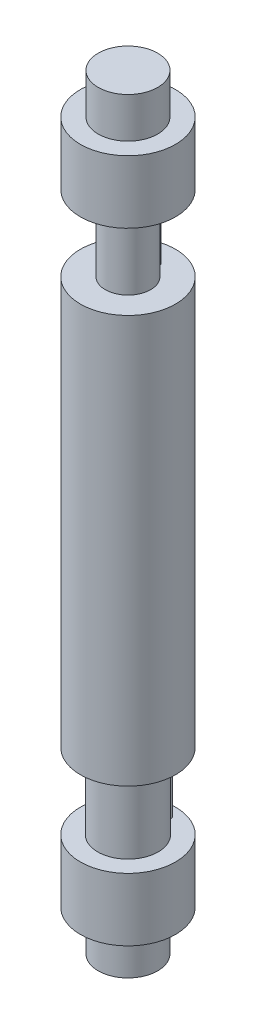
ISO-10303-21;
HEADER;
FILE_DESCRIPTION(('STEP AP214'),'2;1');
FILE_NAME('part.step','',(''),(''),'','','');
FILE_SCHEMA(('AUTOMOTIVE_DESIGN { 1 0 10303 214 1 1 1 1 }'));
ENDSEC;
DATA;
#1=APPLICATION_CONTEXT('core data for automotive mechanical design processes');
#2=APPLICATION_PROTOCOL_DEFINITION('international standard','automotive_design',2000,#1);
#3=PRODUCT_CONTEXT('',#1,'mechanical');
#4=PRODUCT('Part','Part','',(#3));
#5=PRODUCT_RELATED_PRODUCT_CATEGORY('part','',(#4));
#6=PRODUCT_DEFINITION_FORMATION('','',#4);
#7=PRODUCT_DEFINITION_CONTEXT('part definition',#1,'design');
#8=PRODUCT_DEFINITION('design','',#6,#7);
#9=PRODUCT_DEFINITION_SHAPE('','',#8);
#10=(LENGTH_UNIT() NAMED_UNIT(*) SI_UNIT(.MILLI.,.METRE.));
#11=(NAMED_UNIT(*) PLANE_ANGLE_UNIT() SI_UNIT($,.RADIAN.));
#12=(NAMED_UNIT(*) SI_UNIT($,.STERADIAN.) SOLID_ANGLE_UNIT());
#13=UNCERTAINTY_MEASURE_WITH_UNIT(LENGTH_MEASURE(1.E-05),#10,'distance_accuracy_value','');
#14=(GEOMETRIC_REPRESENTATION_CONTEXT(3) GLOBAL_UNCERTAINTY_ASSIGNED_CONTEXT((#13)) GLOBAL_UNIT_ASSIGNED_CONTEXT((#10,
#11,#12)) REPRESENTATION_CONTEXT('',''));
#15=CARTESIAN_POINT('',(0.,0.,0.));
#16=DIRECTION('',(0.,0.,1.));
#17=DIRECTION('',(1.,0.,0.));
#18=AXIS2_PLACEMENT_3D('',#15,#16,#17);
#19=CARTESIAN_POINT('',(0.,17.,0.));
#20=DIRECTION('',(0.,-1.,0.));
#21=DIRECTION('',(0.,0.,-1.));
#22=AXIS2_PLACEMENT_3D('',#19,#20,#21);
#23=CYLINDRICAL_SURFACE('',#22,12.5);
#24=CARTESIAN_POINT('',(0.,17.,0.));
#25=DIRECTION('',(0.,1.,0.));
#26=DIRECTION('',(0.,0.,1.));
#27=AXIS2_PLACEMENT_3D('',#24,#25,#26);
#28=CIRCLE('',#27,12.5);
#29=CARTESIAN_POINT('',(0.,17.,12.5));
#30=VERTEX_POINT('',#29);
#31=EDGE_CURVE('E176',#30,#30,#28,.T.);
#32=ORIENTED_EDGE('',*,*,#31,.F.);
#33=EDGE_LOOP('',(#32));
#34=FACE_BOUND('',#33,.T.);
#35=CARTESIAN_POINT('',(0.,0.,0.));
#36=DIRECTION('',(0.,1.,0.));
#37=DIRECTION('',(0.,0.,1.));
#38=AXIS2_PLACEMENT_3D('',#35,#36,#37);
#39=CIRCLE('',#38,12.5);
#40=CARTESIAN_POINT('',(0.,0.,12.5));
#41=VERTEX_POINT('',#40);
#42=EDGE_CURVE('E36',#41,#41,#39,.T.);
#43=ORIENTED_EDGE('',*,*,#42,.T.);
#44=EDGE_LOOP('',(#43));
#45=FACE_BOUND('',#44,.T.);
#46=ADVANCED_FACE('F33',(#34,#45),#23,.T.);
#47=CARTESIAN_POINT('',(0.,0.,0.));
#48=DIRECTION('',(0.,1.,0.));
#49=DIRECTION('',(0.,0.,1.));
#50=AXIS2_PLACEMENT_3D('',#47,#48,#49);
#51=PLANE('',#50);
#52=ORIENTED_EDGE('',*,*,#42,.F.);
#53=EDGE_LOOP('',(#52));
#54=FACE_BOUND('',#53,.T.);
#55=ADVANCED_FACE('F188',(#54),#51,.F.);
#56=CARTESIAN_POINT('',(0.,43.425,0.));
#57=DIRECTION('',(0.,-1.,0.));
#58=DIRECTION('',(0.,0.,-1.));
#59=AXIS2_PLACEMENT_3D('',#56,#57,#58);
#60=CYLINDRICAL_SURFACE('',#59,20.);
#61=CARTESIAN_POINT('',(0.,43.425,0.));
#62=DIRECTION('',(0.,1.,0.));
#63=DIRECTION('',(0.,0.,1.));
#64=AXIS2_PLACEMENT_3D('',#61,#62,#63);
#65=CIRCLE('',#64,20.);
#66=CARTESIAN_POINT('',(0.,43.425,20.));
#67=VERTEX_POINT('',#66);
#68=EDGE_CURVE('E177',#67,#67,#65,.T.);
#69=ORIENTED_EDGE('',*,*,#68,.F.);
#70=EDGE_LOOP('',(#69));
#71=FACE_BOUND('',#70,.T.);
#72=CARTESIAN_POINT('',(0.,17.,0.));
#73=DIRECTION('',(0.,1.,0.));
#74=DIRECTION('',(0.,0.,1.));
#75=AXIS2_PLACEMENT_3D('',#72,#73,#74);
#76=CIRCLE('',#75,20.);
#77=CARTESIAN_POINT('',(0.,17.,20.));
#78=VERTEX_POINT('',#77);
#79=EDGE_CURVE('E173',#78,#78,#76,.T.);
#80=ORIENTED_EDGE('',*,*,#79,.T.);
#81=EDGE_LOOP('',(#80));
#82=FACE_BOUND('',#81,.T.);
#83=ADVANCED_FACE('F190',(#71,#82),#60,.T.);
#84=CARTESIAN_POINT('',(0.,43.425,0.));
#85=DIRECTION('',(0.,1.,0.));
#86=DIRECTION('',(0.,0.,1.));
#87=AXIS2_PLACEMENT_3D('',#84,#85,#86);
#88=PLANE('',#87);
#89=DIRECTION('',(0.,0.,-1.));
#90=VECTOR('',#89,1.);
#91=CARTESIAN_POINT('',(-3.175,43.425,-15.4717221242085));
#92=LINE('',#91,#90);
#93=CARTESIAN_POINT('',(-3.175,43.425,-12.2967221242085));
#94=VERTEX_POINT('',#93);
#95=CARTESIAN_POINT('',(-3.175,43.425,-15.4717221242085));
#96=VERTEX_POINT('',#95);
#97=EDGE_CURVE('E150',#94,#96,#92,.T.);
#98=ORIENTED_EDGE('',*,*,#97,.T.);
#99=DIRECTION('',(1.,0.,0.));
#100=VECTOR('',#99,1.);
#101=CARTESIAN_POINT('',(3.175,43.425,-15.4717221242085));
#102=LINE('',#101,#100);
#103=CARTESIAN_POINT('',(3.175,43.425,-15.4717221242085));
#104=VERTEX_POINT('',#103);
#105=EDGE_CURVE('E146',#96,#104,#102,.T.);
#106=ORIENTED_EDGE('',*,*,#105,.T.);
#107=DIRECTION('',(0.,0.,1.));
#108=VECTOR('',#107,1.);
#109=CARTESIAN_POINT('',(3.175,43.425,-15.4717221242085));
#110=LINE('',#109,#108);
#111=CARTESIAN_POINT('',(3.175,43.425,-12.2967221242085));
#112=VERTEX_POINT('',#111);
#113=EDGE_CURVE('E49',#104,#112,#110,.T.);
#114=ORIENTED_EDGE('',*,*,#113,.T.);
#115=CARTESIAN_POINT('',(0.,43.425,0.));
#116=DIRECTION('',(0.,1.,0.));
#117=DIRECTION('',(0.,0.,1.));
#118=AXIS2_PLACEMENT_3D('',#115,#116,#117);
#119=CIRCLE('',#118,12.7);
#120=EDGE_CURVE('E138',#94,#112,#119,.T.);
#121=ORIENTED_EDGE('',*,*,#120,.F.);
#122=EDGE_LOOP('',(#98,#106,#114,#121));
#123=FACE_BOUND('',#122,.T.);
#124=ORIENTED_EDGE('',*,*,#68,.T.);
#125=EDGE_LOOP('',(#124));
#126=FACE_BOUND('',#125,.T.);
#127=ADVANCED_FACE('F195',(#123,#126),#88,.T.);
#128=CARTESIAN_POINT('',(0.,17.,0.));
#129=DIRECTION('',(0.,1.,0.));
#130=DIRECTION('',(0.,0.,1.));
#131=AXIS2_PLACEMENT_3D('',#128,#129,#130);
#132=PLANE('',#131);
#133=ORIENTED_EDGE('',*,*,#31,.T.);
#134=EDGE_LOOP('',(#133));
#135=FACE_BOUND('',#134,.T.);
#136=ORIENTED_EDGE('',*,*,#79,.F.);
#137=EDGE_LOOP('',(#136));
#138=FACE_BOUND('',#137,.T.);
#139=ADVANCED_FACE('F200',(#135,#138),#132,.F.);
#140=CARTESIAN_POINT('',(0.,75.175,0.));
#141=DIRECTION('',(0.,-1.,0.));
#142=DIRECTION('',(0.,0.,-1.));
#143=AXIS2_PLACEMENT_3D('',#140,#141,#142);
#144=CYLINDRICAL_SURFACE('',#143,12.7);
#145=CARTESIAN_POINT('',(0.,75.175,0.));
#146=DIRECTION('',(0.,1.,0.));
#147=DIRECTION('',(0.,0.,1.));
#148=AXIS2_PLACEMENT_3D('',#145,#146,#147);
#149=CIRCLE('',#148,12.7);
#150=CARTESIAN_POINT('',(-3.17500000000001,75.175,-12.2967221242085));
#151=VERTEX_POINT('',#150);
#152=CARTESIAN_POINT('',(3.175,75.175,-12.2967221242085));
#153=VERTEX_POINT('',#152);
#154=EDGE_CURVE('E153',#151,#153,#149,.T.);
#155=ORIENTED_EDGE('',*,*,#154,.F.);
#156=DIRECTION('',(0.,1.,0.));
#157=VECTOR('',#156,1.);
#158=CARTESIAN_POINT('',(-3.175,36.3254841714382,-12.2967221242085));
#159=LINE('',#158,#157);
#160=EDGE_CURVE('E162',#94,#151,#159,.T.);
#161=ORIENTED_EDGE('',*,*,#160,.F.);
#162=ORIENTED_EDGE('',*,*,#120,.T.);
#163=DIRECTION('',(0.,1.,0.));
#164=VECTOR('',#163,1.);
#165=CARTESIAN_POINT('',(3.175,36.3254841714382,-12.2967221242085));
#166=LINE('',#165,#164);
#167=EDGE_CURVE('E166',#112,#153,#166,.T.);
#168=ORIENTED_EDGE('',*,*,#167,.T.);
#169=EDGE_LOOP('',(#155,#161,#162,#168));
#170=FACE_BOUND('',#169,.T.);
#171=ADVANCED_FACE('F203',(#170),#144,.T.);
#172=CARTESIAN_POINT('',(-3.175,36.3254841714382,-15.4717221242085));
#173=DIRECTION('',(-1.,0.,0.));
#174=DIRECTION('',(0.,0.,1.));
#175=AXIS2_PLACEMENT_3D('',#172,#173,#174);
#176=PLANE('',#175);
#177=ORIENTED_EDGE('',*,*,#97,.F.);
#178=ORIENTED_EDGE('',*,*,#160,.T.);
#179=DIRECTION('',(0.,0.,1.));
#180=VECTOR('',#179,1.);
#181=CARTESIAN_POINT('',(-3.175,75.175,-15.4717221242085));
#182=LINE('',#181,#180);
#183=CARTESIAN_POINT('',(-3.175,75.175,-15.4717221242085));
#184=VERTEX_POINT('',#183);
#185=EDGE_CURVE('E142',#184,#151,#182,.T.);
#186=ORIENTED_EDGE('',*,*,#185,.F.);
#187=DIRECTION('',(0.,1.,0.));
#188=VECTOR('',#187,1.);
#189=CARTESIAN_POINT('',(-3.175,36.3254841714382,-15.4717221242085));
#190=LINE('',#189,#188);
#191=EDGE_CURVE('E147',#96,#184,#190,.T.);
#192=ORIENTED_EDGE('',*,*,#191,.F.);
#193=EDGE_LOOP('',(#177,#178,#186,#192));
#194=FACE_BOUND('',#193,.T.);
#195=ADVANCED_FACE('F209',(#194),#176,.T.);
#196=CARTESIAN_POINT('',(3.175,36.3254841714382,-15.4717221242085));
#197=DIRECTION('',(0.,0.,-1.));
#198=DIRECTION('',(-1.,0.,0.));
#199=AXIS2_PLACEMENT_3D('',#196,#197,#198);
#200=PLANE('',#199);
#201=ORIENTED_EDGE('',*,*,#105,.F.);
#202=ORIENTED_EDGE('',*,*,#191,.T.);
#203=DIRECTION('',(-1.,0.,0.));
#204=VECTOR('',#203,1.);
#205=CARTESIAN_POINT('',(3.175,75.175,-15.4717221242085));
#206=LINE('',#205,#204);
#207=CARTESIAN_POINT('',(3.175,75.175,-15.4717221242085));
#208=VERTEX_POINT('',#207);
#209=EDGE_CURVE('E159',#208,#184,#206,.T.);
#210=ORIENTED_EDGE('',*,*,#209,.F.);
#211=DIRECTION('',(0.,1.,0.));
#212=VECTOR('',#211,1.);
#213=CARTESIAN_POINT('',(3.175,36.3254841714382,-15.4717221242085));
#214=LINE('',#213,#212);
#215=EDGE_CURVE('E164',#104,#208,#214,.T.);
#216=ORIENTED_EDGE('',*,*,#215,.F.);
#217=EDGE_LOOP('',(#201,#202,#210,#216));
#218=FACE_BOUND('',#217,.T.);
#219=ADVANCED_FACE('F213',(#218),#200,.T.);
#220=CARTESIAN_POINT('',(3.175,36.3254841714382,-15.4717221242085));
#221=DIRECTION('',(1.,0.,0.));
#222=DIRECTION('',(0.,0.,-1.));
#223=AXIS2_PLACEMENT_3D('',#220,#221,#222);
#224=PLANE('',#223);
#225=ORIENTED_EDGE('',*,*,#113,.F.);
#226=ORIENTED_EDGE('',*,*,#215,.T.);
#227=DIRECTION('',(0.,0.,-1.));
#228=VECTOR('',#227,1.);
#229=CARTESIAN_POINT('',(3.175,75.175,-15.4717221242085));
#230=LINE('',#229,#228);
#231=EDGE_CURVE('E156',#153,#208,#230,.T.);
#232=ORIENTED_EDGE('',*,*,#231,.F.);
#233=ORIENTED_EDGE('',*,*,#167,.F.);
#234=EDGE_LOOP('',(#225,#226,#232,#233));
#235=FACE_BOUND('',#234,.T.);
#236=ADVANCED_FACE('F215',(#235),#224,.T.);
#237=CARTESIAN_POINT('',(0.,75.175,0.));
#238=DIRECTION('',(0.,1.,0.));
#239=DIRECTION('',(0.,0.,1.));
#240=AXIS2_PLACEMENT_3D('',#237,#238,#239);
#241=PLANE('',#240);
#242=CARTESIAN_POINT('',(0.,75.175,0.));
#243=DIRECTION('',(0.,1.,0.));
#244=DIRECTION('',(0.,0.,1.));
#245=AXIS2_PLACEMENT_3D('',#242,#243,#244);
#246=CIRCLE('',#245,20.);
#247=CARTESIAN_POINT('',(0.,75.175,20.));
#248=VERTEX_POINT('',#247);
#249=EDGE_CURVE('E106',#248,#248,#246,.T.);
#250=ORIENTED_EDGE('',*,*,#249,.F.);
#251=EDGE_LOOP('',(#250));
#252=FACE_BOUND('',#251,.T.);
#253=ORIENTED_EDGE('',*,*,#185,.T.);
#254=ORIENTED_EDGE('',*,*,#154,.T.);
#255=ORIENTED_EDGE('',*,*,#231,.T.);
#256=ORIENTED_EDGE('',*,*,#209,.T.);
#257=EDGE_LOOP('',(#253,#254,#255,#256));
#258=FACE_BOUND('',#257,.T.);
#259=ADVANCED_FACE('F218',(#252,#258),#241,.F.);
#260=CARTESIAN_POINT('',(0.,246.625,0.));
#261=DIRECTION('',(0.,-1.,0.));
#262=DIRECTION('',(0.,0.,-1.));
#263=AXIS2_PLACEMENT_3D('',#260,#261,#262);
#264=CYLINDRICAL_SURFACE('',#263,20.);
#265=CARTESIAN_POINT('',(0.,246.625,0.));
#266=DIRECTION('',(0.,1.,0.));
#267=DIRECTION('',(0.,0.,1.));
#268=AXIS2_PLACEMENT_3D('',#265,#266,#267);
#269=CIRCLE('',#268,20.);
#270=CARTESIAN_POINT('',(0.,246.625,20.));
#271=VERTEX_POINT('',#270);
#272=EDGE_CURVE('E139',#271,#271,#269,.T.);
#273=ORIENTED_EDGE('',*,*,#272,.F.);
#274=EDGE_LOOP('',(#273));
#275=FACE_BOUND('',#274,.T.);
#276=ORIENTED_EDGE('',*,*,#249,.T.);
#277=EDGE_LOOP('',(#276));
#278=FACE_BOUND('',#277,.T.);
#279=ADVANCED_FACE('F222',(#275,#278),#264,.T.);
#280=CARTESIAN_POINT('',(0.,246.625,0.));
#281=DIRECTION('',(0.,1.,0.));
#282=DIRECTION('',(0.,0.,1.));
#283=AXIS2_PLACEMENT_3D('',#280,#281,#282);
#284=PLANE('',#283);
#285=DIRECTION('',(0.,0.,-1.));
#286=VECTOR('',#285,1.);
#287=CARTESIAN_POINT('',(-2.38125,246.625,-11.6037915931564));
#288=LINE('',#287,#286);
#289=CARTESIAN_POINT('',(-2.38125,246.625,-9.22254159315641));
#290=VERTEX_POINT('',#289);
#291=CARTESIAN_POINT('',(-2.38125,246.625,-11.6037915931564));
#292=VERTEX_POINT('',#291);
#293=EDGE_CURVE('E107',#290,#292,#288,.T.);
#294=ORIENTED_EDGE('',*,*,#293,.T.);
#295=DIRECTION('',(1.,0.,0.));
#296=VECTOR('',#295,1.);
#297=CARTESIAN_POINT('',(2.38125,246.625,-11.6037915931564));
#298=LINE('',#297,#296);
#299=CARTESIAN_POINT('',(2.38125,246.625,-11.6037915931564));
#300=VERTEX_POINT('',#299);
#301=EDGE_CURVE('E273',#292,#300,#298,.T.);
#302=ORIENTED_EDGE('',*,*,#301,.T.);
#303=DIRECTION('',(0.,0.,1.));
#304=VECTOR('',#303,1.);
#305=CARTESIAN_POINT('',(2.38125,246.625,-11.6037915931564));
#306=LINE('',#305,#304);
#307=CARTESIAN_POINT('',(2.38125,246.625,-9.22254159315641));
#308=VERTEX_POINT('',#307);
#309=EDGE_CURVE('E133',#300,#308,#306,.T.);
#310=ORIENTED_EDGE('',*,*,#309,.T.);
#311=CARTESIAN_POINT('',(0.,246.625,0.));
#312=DIRECTION('',(0.,1.,0.));
#313=DIRECTION('',(0.,0.,1.));
#314=AXIS2_PLACEMENT_3D('',#311,#312,#313);
#315=CIRCLE('',#314,9.525);
#316=EDGE_CURVE('E42',#290,#308,#315,.T.);
#317=ORIENTED_EDGE('',*,*,#316,.F.);
#318=EDGE_LOOP('',(#294,#302,#310,#317));
#319=FACE_BOUND('',#318,.T.);
#320=ORIENTED_EDGE('',*,*,#272,.T.);
#321=EDGE_LOOP('',(#320));
#322=FACE_BOUND('',#321,.T.);
#323=ADVANCED_FACE('F225',(#319,#322),#284,.T.);
#324=CARTESIAN_POINT('',(0.,278.375,0.));
#325=DIRECTION('',(0.,-1.,0.));
#326=DIRECTION('',(0.,0.,-1.));
#327=AXIS2_PLACEMENT_3D('',#324,#325,#326);
#328=CYLINDRICAL_SURFACE('',#327,9.525);
#329=CARTESIAN_POINT('',(0.,278.375,0.));
#330=DIRECTION('',(0.,1.,0.));
#331=DIRECTION('',(0.,0.,1.));
#332=AXIS2_PLACEMENT_3D('',#329,#330,#331);
#333=CIRCLE('',#332,9.525);
#334=CARTESIAN_POINT('',(-2.38125,278.375,-9.22254159315641));
#335=VERTEX_POINT('',#334);
#336=CARTESIAN_POINT('',(2.38125,278.375,-9.22254159315641));
#337=VERTEX_POINT('',#336);
#338=EDGE_CURVE('E96',#335,#337,#333,.T.);
#339=ORIENTED_EDGE('',*,*,#338,.F.);
#340=DIRECTION('',(0.,1.,0.));
#341=VECTOR('',#340,1.);
#342=CARTESIAN_POINT('',(-2.38125,241.300363128579,-9.22254159315641));
#343=LINE('',#342,#341);
#344=EDGE_CURVE('E100',#290,#335,#343,.T.);
#345=ORIENTED_EDGE('',*,*,#344,.F.);
#346=ORIENTED_EDGE('',*,*,#316,.T.);
#347=DIRECTION('',(0.,1.,0.));
#348=VECTOR('',#347,1.);
#349=CARTESIAN_POINT('',(2.38125,241.300363128579,-9.22254159315641));
#350=LINE('',#349,#348);
#351=EDGE_CURVE('E102',#308,#337,#350,.T.);
#352=ORIENTED_EDGE('',*,*,#351,.T.);
#353=EDGE_LOOP('',(#339,#345,#346,#352));
#354=FACE_BOUND('',#353,.T.);
#355=ADVANCED_FACE('F98',(#354),#328,.T.);
#356=CARTESIAN_POINT('',(-2.38125,241.300363128579,-11.6037915931564));
#357=DIRECTION('',(-1.,0.,0.));
#358=DIRECTION('',(0.,0.,1.));
#359=AXIS2_PLACEMENT_3D('',#356,#357,#358);
#360=PLANE('',#359);
#361=ORIENTED_EDGE('',*,*,#293,.F.);
#362=ORIENTED_EDGE('',*,*,#344,.T.);
#363=DIRECTION('',(0.,0.,1.));
#364=VECTOR('',#363,1.);
#365=CARTESIAN_POINT('',(-2.38125,278.375,-11.6037915931564));
#366=LINE('',#365,#364);
#367=CARTESIAN_POINT('',(-2.38125,278.375,-11.6037915931564));
#368=VERTEX_POINT('',#367);
#369=EDGE_CURVE('E113',#368,#335,#366,.T.);
#370=ORIENTED_EDGE('',*,*,#369,.F.);
#371=DIRECTION('',(0.,1.,0.));
#372=VECTOR('',#371,1.);
#373=CARTESIAN_POINT('',(-2.38125,241.300363128579,-11.6037915931564));
#374=LINE('',#373,#372);
#375=EDGE_CURVE('E131',#292,#368,#374,.T.);
#376=ORIENTED_EDGE('',*,*,#375,.F.);
#377=EDGE_LOOP('',(#361,#362,#370,#376));
#378=FACE_BOUND('',#377,.T.);
#379=ADVANCED_FACE('F111',(#378),#360,.T.);
#380=CARTESIAN_POINT('',(2.38125,241.300363128579,-11.6037915931564));
#381=DIRECTION('',(0.,0.,-1.));
#382=DIRECTION('',(-1.,0.,0.));
#383=AXIS2_PLACEMENT_3D('',#380,#381,#382);
#384=PLANE('',#383);
#385=ORIENTED_EDGE('',*,*,#301,.F.);
#386=ORIENTED_EDGE('',*,*,#375,.T.);
#387=DIRECTION('',(-1.,0.,0.));
#388=VECTOR('',#387,1.);
#389=CARTESIAN_POINT('',(2.38125,278.375,-11.6037915931564));
#390=LINE('',#389,#388);
#391=CARTESIAN_POINT('',(2.38125,278.375,-11.6037915931564));
#392=VERTEX_POINT('',#391);
#393=EDGE_CURVE('E116',#392,#368,#390,.T.);
#394=ORIENTED_EDGE('',*,*,#393,.F.);
#395=DIRECTION('',(0.,1.,0.));
#396=VECTOR('',#395,1.);
#397=CARTESIAN_POINT('',(2.38125,241.300363128579,-11.6037915931564));
#398=LINE('',#397,#396);
#399=EDGE_CURVE('E134',#300,#392,#398,.T.);
#400=ORIENTED_EDGE('',*,*,#399,.F.);
#401=EDGE_LOOP('',(#385,#386,#394,#400));
#402=FACE_BOUND('',#401,.T.);
#403=ADVANCED_FACE('F237',(#402),#384,.T.);
#404=CARTESIAN_POINT('',(2.38125,241.300363128579,-11.6037915931564));
#405=DIRECTION('',(1.,0.,0.));
#406=DIRECTION('',(0.,0.,-1.));
#407=AXIS2_PLACEMENT_3D('',#404,#405,#406);
#408=PLANE('',#407);
#409=ORIENTED_EDGE('',*,*,#309,.F.);
#410=ORIENTED_EDGE('',*,*,#399,.T.);
#411=DIRECTION('',(0.,0.,-1.));
#412=VECTOR('',#411,1.);
#413=CARTESIAN_POINT('',(2.38125,278.375,-11.6037915931564));
#414=LINE('',#413,#412);
#415=EDGE_CURVE('E120',#337,#392,#414,.T.);
#416=ORIENTED_EDGE('',*,*,#415,.F.);
#417=ORIENTED_EDGE('',*,*,#351,.F.);
#418=EDGE_LOOP('',(#409,#410,#416,#417));
#419=FACE_BOUND('',#418,.T.);
#420=ADVANCED_FACE('F238',(#419),#408,.T.);
#421=CARTESIAN_POINT('',(0.,278.375,0.));
#422=DIRECTION('',(0.,1.,0.));
#423=DIRECTION('',(0.,0.,1.));
#424=AXIS2_PLACEMENT_3D('',#421,#422,#423);
#425=PLANE('',#424);
#426=CARTESIAN_POINT('',(0.,278.375,0.));
#427=DIRECTION('',(0.,1.,0.));
#428=DIRECTION('',(0.,0.,1.));
#429=AXIS2_PLACEMENT_3D('',#426,#427,#428);
#430=CIRCLE('',#429,20.);
#431=CARTESIAN_POINT('',(0.,278.375,20.));
#432=VERTEX_POINT('',#431);
#433=EDGE_CURVE('E125',#432,#432,#430,.T.);
#434=ORIENTED_EDGE('',*,*,#433,.F.);
#435=EDGE_LOOP('',(#434));
#436=FACE_BOUND('',#435,.T.);
#437=ORIENTED_EDGE('',*,*,#369,.T.);
#438=ORIENTED_EDGE('',*,*,#338,.T.);
#439=ORIENTED_EDGE('',*,*,#415,.T.);
#440=ORIENTED_EDGE('',*,*,#393,.T.);
#441=EDGE_LOOP('',(#437,#438,#439,#440));
#442=FACE_BOUND('',#441,.T.);
#443=ADVANCED_FACE('F118',(#436,#442),#425,.F.);
#444=CARTESIAN_POINT('',(0.,304.8,0.));
#445=DIRECTION('',(0.,-1.,0.));
#446=DIRECTION('',(0.,0.,-1.));
#447=AXIS2_PLACEMENT_3D('',#444,#445,#446);
#448=CYLINDRICAL_SURFACE('',#447,20.);
#449=CARTESIAN_POINT('',(0.,304.8,0.));
#450=DIRECTION('',(0.,1.,0.));
#451=DIRECTION('',(0.,0.,1.));
#452=AXIS2_PLACEMENT_3D('',#449,#450,#451);
#453=CIRCLE('',#452,20.);
#454=CARTESIAN_POINT('',(0.,304.8,20.));
#455=VERTEX_POINT('',#454);
#456=EDGE_CURVE('E121',#455,#455,#453,.T.);
#457=ORIENTED_EDGE('',*,*,#456,.F.);
#458=EDGE_LOOP('',(#457));
#459=FACE_BOUND('',#458,.T.);
#460=ORIENTED_EDGE('',*,*,#433,.T.);
#461=EDGE_LOOP('',(#460));
#462=FACE_BOUND('',#461,.T.);
#463=ADVANCED_FACE('F245',(#459,#462),#448,.T.);
#464=CARTESIAN_POINT('',(0.,304.8,0.));
#465=DIRECTION('',(0.,1.,0.));
#466=DIRECTION('',(0.,0.,1.));
#467=AXIS2_PLACEMENT_3D('',#464,#465,#466);
#468=PLANE('',#467);
#469=CARTESIAN_POINT('',(0.,304.8,0.));
#470=DIRECTION('',(0.,1.,0.));
#471=DIRECTION('',(0.,0.,1.));
#472=AXIS2_PLACEMENT_3D('',#469,#470,#471);
#473=CIRCLE('',#472,12.5);
#474=CARTESIAN_POINT('',(0.,304.8,12.5));
#475=VERTEX_POINT('',#474);
#476=EDGE_CURVE('E11',#475,#475,#473,.T.);
#477=ORIENTED_EDGE('',*,*,#476,.F.);
#478=EDGE_LOOP('',(#477));
#479=FACE_BOUND('',#478,.T.);
#480=ORIENTED_EDGE('',*,*,#456,.T.);
#481=EDGE_LOOP('',(#480));
#482=FACE_BOUND('',#481,.T.);
#483=ADVANCED_FACE('F248',(#479,#482),#468,.T.);
#484=CARTESIAN_POINT('',(0.,321.8,0.));
#485=DIRECTION('',(0.,-1.,0.));
#486=DIRECTION('',(0.,0.,-1.));
#487=AXIS2_PLACEMENT_3D('',#484,#485,#486);
#488=CYLINDRICAL_SURFACE('',#487,12.5);
#489=CARTESIAN_POINT('',(0.,321.8,0.));
#490=DIRECTION('',(0.,1.,0.));
#491=DIRECTION('',(0.,0.,1.));
#492=AXIS2_PLACEMENT_3D('',#489,#490,#491);
#493=CIRCLE('',#492,12.5);
#494=CARTESIAN_POINT('',(0.,321.8,12.5));
#495=VERTEX_POINT('',#494);
#496=EDGE_CURVE('E267',#495,#495,#493,.T.);
#497=ORIENTED_EDGE('',*,*,#496,.F.);
#498=EDGE_LOOP('',(#497));
#499=FACE_BOUND('',#498,.T.);
#500=ORIENTED_EDGE('',*,*,#476,.T.);
#501=EDGE_LOOP('',(#500));
#502=FACE_BOUND('',#501,.T.);
#503=ADVANCED_FACE('F255',(#499,#502),#488,.T.);
#504=CARTESIAN_POINT('',(0.,321.8,0.));
#505=DIRECTION('',(0.,1.,0.));
#506=DIRECTION('',(0.,0.,1.));
#507=AXIS2_PLACEMENT_3D('',#504,#505,#506);
#508=PLANE('',#507);
#509=ORIENTED_EDGE('',*,*,#496,.T.);
#510=EDGE_LOOP('',(#509));
#511=FACE_BOUND('',#510,.T.);
#512=ADVANCED_FACE('F259',(#511),#508,.T.);
#513=CLOSED_SHELL('',(#46,#55,#83,#127,#139,#171,#195,#219,#236,#259,#279,#323,#355,#379,#403,
#420,#443,#463,#483,#503,#512));
#514=MANIFOLD_SOLID_BREP('B2',#513);
#515=ADVANCED_BREP_SHAPE_REPRESENTATION('',(#18,#514),#14);
#516=SHAPE_DEFINITION_REPRESENTATION(#9,#515);
ENDSEC;
END-ISO-10303-21;
